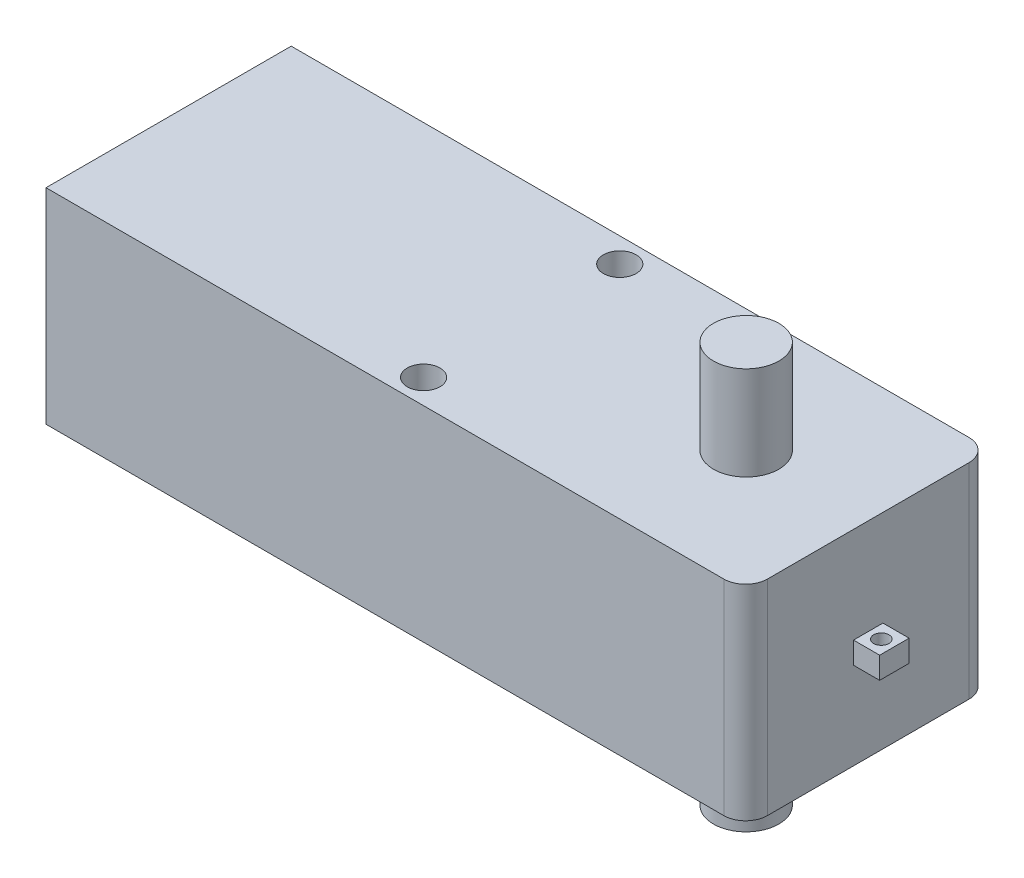
ISO-10303-21;
HEADER;
FILE_DESCRIPTION(('STEP AP214'),'2;1');
FILE_NAME('part.step','',(''),(''),'','','');
FILE_SCHEMA(('AUTOMOTIVE_DESIGN { 1 0 10303 214 1 1 1 1 }'));
ENDSEC;
DATA;
#1=APPLICATION_CONTEXT('core data for automotive mechanical design processes');
#2=APPLICATION_PROTOCOL_DEFINITION('international standard','automotive_design',2000,#1);
#3=PRODUCT_CONTEXT('',#1,'mechanical');
#4=PRODUCT('Part','Part','',(#3));
#5=PRODUCT_RELATED_PRODUCT_CATEGORY('part','',(#4));
#6=PRODUCT_DEFINITION_FORMATION('','',#4);
#7=PRODUCT_DEFINITION_CONTEXT('part definition',#1,'design');
#8=PRODUCT_DEFINITION('design','',#6,#7);
#9=PRODUCT_DEFINITION_SHAPE('','',#8);
#10=(LENGTH_UNIT() NAMED_UNIT(*) SI_UNIT(.MILLI.,.METRE.));
#11=(NAMED_UNIT(*) PLANE_ANGLE_UNIT() SI_UNIT($,.RADIAN.));
#12=(NAMED_UNIT(*) SI_UNIT($,.STERADIAN.) SOLID_ANGLE_UNIT());
#13=UNCERTAINTY_MEASURE_WITH_UNIT(LENGTH_MEASURE(1.E-05),#10,'distance_accuracy_value','');
#14=(GEOMETRIC_REPRESENTATION_CONTEXT(3) GLOBAL_UNCERTAINTY_ASSIGNED_CONTEXT((#13)) GLOBAL_UNIT_ASSIGNED_CONTEXT((#10,
#11,#12)) REPRESENTATION_CONTEXT('',''));
#15=CARTESIAN_POINT('',(0.,0.,0.));
#16=DIRECTION('',(0.,0.,1.));
#17=DIRECTION('',(1.,0.,0.));
#18=AXIS2_PLACEMENT_3D('',#15,#16,#17);
#19=CARTESIAN_POINT('',(64.2,18.8,0.));
#20=DIRECTION('',(-1.,0.,0.));
#21=DIRECTION('',(0.,0.,1.));
#22=AXIS2_PLACEMENT_3D('',#19,#20,#21);
#23=PLANE('',#22);
#24=DIRECTION('',(0.,0.,-1.));
#25=VECTOR('',#24,1.);
#26=CARTESIAN_POINT('',(64.2,18.8,0.));
#27=LINE('',#26,#25);
#28=CARTESIAN_POINT('',(64.2,18.8,-2.));
#29=VERTEX_POINT('',#28);
#30=CARTESIAN_POINT('',(64.2,18.8,-20.5));
#31=VERTEX_POINT('',#30);
#32=EDGE_CURVE('E175',#29,#31,#27,.T.);
#33=ORIENTED_EDGE('',*,*,#32,.F.);
#34=DIRECTION('',(0.,-1.,0.));
#35=VECTOR('',#34,1.);
#36=CARTESIAN_POINT('',(64.2,18.8,-2.));
#37=LINE('',#36,#35);
#38=CARTESIAN_POINT('',(64.2,0.,-2.));
#39=VERTEX_POINT('',#38);
#40=EDGE_CURVE('E195',#29,#39,#37,.T.);
#41=ORIENTED_EDGE('',*,*,#40,.T.);
#42=DIRECTION('',(0.,0.,-1.));
#43=VECTOR('',#42,1.);
#44=CARTESIAN_POINT('',(64.2,0.,0.));
#45=LINE('',#44,#43);
#46=CARTESIAN_POINT('',(64.2,0.,-20.5));
#47=VERTEX_POINT('',#46);
#48=EDGE_CURVE('E184',#39,#47,#45,.T.);
#49=ORIENTED_EDGE('',*,*,#48,.T.);
#50=DIRECTION('',(0.,-1.,0.));
#51=VECTOR('',#50,1.);
#52=CARTESIAN_POINT('',(64.2,18.8,-20.5));
#53=LINE('',#52,#51);
#54=EDGE_CURVE('E154',#47,#31,#53,.F.);
#55=ORIENTED_EDGE('',*,*,#54,.T.);
#56=EDGE_LOOP('',(#33,#41,#49,#55));
#57=FACE_BOUND('',#56,.T.);
#58=DIRECTION('',(0.,-1.,0.));
#59=VECTOR('',#58,1.);
#60=CARTESIAN_POINT('',(64.2,10.,-12.6006994628289));
#61=LINE('',#60,#59);
#62=CARTESIAN_POINT('',(64.2,10.,-12.6006994628289));
#63=VERTEX_POINT('',#62);
#64=CARTESIAN_POINT('',(64.2,8.,-12.6006994628289));
#65=VERTEX_POINT('',#64);
#66=EDGE_CURVE('E120',#63,#65,#61,.T.);
#67=ORIENTED_EDGE('',*,*,#66,.T.);
#68=DIRECTION('',(0.,0.,1.));
#69=VECTOR('',#68,1.);
#70=CARTESIAN_POINT('',(64.2,8.,-12.6006994628289));
#71=LINE('',#70,#69);
#72=CARTESIAN_POINT('',(64.2,8.,-9.89930053717109));
#73=VERTEX_POINT('',#72);
#74=EDGE_CURVE('E311',#65,#73,#71,.T.);
#75=ORIENTED_EDGE('',*,*,#74,.T.);
#76=DIRECTION('',(0.,-1.,0.));
#77=VECTOR('',#76,1.);
#78=CARTESIAN_POINT('',(64.2,10.,-9.89930053717109));
#79=LINE('',#78,#77);
#80=CARTESIAN_POINT('',(64.2,10.,-9.89930053717109));
#81=VERTEX_POINT('',#80);
#82=EDGE_CURVE('E144',#81,#73,#79,.T.);
#83=ORIENTED_EDGE('',*,*,#82,.F.);
#84=DIRECTION('',(0.,0.,1.));
#85=VECTOR('',#84,1.);
#86=CARTESIAN_POINT('',(64.2,10.,-12.6006994628289));
#87=LINE('',#86,#85);
#88=EDGE_CURVE('E123',#63,#81,#87,.T.);
#89=ORIENTED_EDGE('',*,*,#88,.F.);
#90=EDGE_LOOP('',(#67,#75,#83,#89));
#91=FACE_BOUND('',#90,.T.);
#92=ADVANCED_FACE('F33',(#57,#91),#23,.F.);
#93=CARTESIAN_POINT('',(0.,18.8,0.));
#94=DIRECTION('',(0.,-1.,0.));
#95=DIRECTION('',(0.,0.,-1.));
#96=AXIS2_PLACEMENT_3D('',#93,#94,#95);
#97=PLANE('',#96);
#98=CARTESIAN_POINT('',(53.,18.8,-11.25));
#99=DIRECTION('',(0.,-1.,0.));
#100=DIRECTION('',(0.,0.,-1.));
#101=AXIS2_PLACEMENT_3D('',#98,#99,#100);
#102=CIRCLE('',#101,3.);
#103=CARTESIAN_POINT('',(53.,18.8,-14.25));
#104=VERTEX_POINT('',#103);
#105=EDGE_CURVE('E151',#104,#104,#102,.F.);
#106=ORIENTED_EDGE('',*,*,#105,.F.);
#107=EDGE_LOOP('',(#106));
#108=FACE_BOUND('',#107,.T.);
#109=DIRECTION('',(1.,0.,0.));
#110=VECTOR('',#109,1.);
#111=CARTESIAN_POINT('',(0.,18.8,0.));
#112=LINE('',#111,#110);
#113=CARTESIAN_POINT('',(0.,18.8,0.));
#114=VERTEX_POINT('',#113);
#115=CARTESIAN_POINT('',(62.2,18.8,0.));
#116=VERTEX_POINT('',#115);
#117=EDGE_CURVE('E172',#114,#116,#112,.T.);
#118=ORIENTED_EDGE('',*,*,#117,.T.);
#119=CARTESIAN_POINT('',(62.2,18.8,-2.));
#120=DIRECTION('',(0.,-1.,0.));
#121=DIRECTION('',(0.,0.,-1.));
#122=AXIS2_PLACEMENT_3D('',#119,#120,#121);
#123=CIRCLE('',#122,2.);
#124=EDGE_CURVE('E41',#116,#29,#123,.F.);
#125=ORIENTED_EDGE('',*,*,#124,.T.);
#126=ORIENTED_EDGE('',*,*,#32,.T.);
#127=CARTESIAN_POINT('',(62.2,18.8,-20.5));
#128=DIRECTION('',(0.,-1.,0.));
#129=DIRECTION('',(0.,0.,-1.));
#130=AXIS2_PLACEMENT_3D('',#127,#128,#129);
#131=CIRCLE('',#130,2.);
#132=CARTESIAN_POINT('',(62.2,18.8,-22.5));
#133=VERTEX_POINT('',#132);
#134=EDGE_CURVE('E48',#31,#133,#131,.F.);
#135=ORIENTED_EDGE('',*,*,#134,.T.);
#136=DIRECTION('',(-1.,0.,0.));
#137=VECTOR('',#136,1.);
#138=CARTESIAN_POINT('',(0.,18.8,-22.5));
#139=LINE('',#138,#137);
#140=CARTESIAN_POINT('',(0.,18.8,-22.5));
#141=VERTEX_POINT('',#140);
#142=EDGE_CURVE('E177',#133,#141,#139,.T.);
#143=ORIENTED_EDGE('',*,*,#142,.T.);
#144=DIRECTION('',(0.,0.,1.));
#145=VECTOR('',#144,1.);
#146=CARTESIAN_POINT('',(0.,18.8,0.));
#147=LINE('',#146,#145);
#148=EDGE_CURVE('E169',#141,#114,#147,.T.);
#149=ORIENTED_EDGE('',*,*,#148,.T.);
#150=EDGE_LOOP('',(#118,#125,#126,#135,#143,#149));
#151=FACE_BOUND('',#150,.T.);
#152=CARTESIAN_POINT('',(32.4,18.8,-2.25));
#153=DIRECTION('',(0.,1.,0.));
#154=DIRECTION('',(0.,0.,1.));
#155=AXIS2_PLACEMENT_3D('',#152,#153,#154);
#156=CIRCLE('',#155,1.5);
#157=CARTESIAN_POINT('',(32.4,18.8,-0.749999999999992));
#158=VERTEX_POINT('',#157);
#159=EDGE_CURVE('E163',#158,#158,#156,.T.);
#160=ORIENTED_EDGE('',*,*,#159,.F.);
#161=EDGE_LOOP('',(#160));
#162=FACE_BOUND('',#161,.T.);
#163=CARTESIAN_POINT('',(32.4,18.8,-20.25));
#164=DIRECTION('',(0.,1.,0.));
#165=DIRECTION('',(0.,0.,-1.));
#166=AXIS2_PLACEMENT_3D('',#163,#164,#165);
#167=CIRCLE('',#166,1.5);
#168=CARTESIAN_POINT('',(32.4,18.8,-21.75));
#169=VERTEX_POINT('',#168);
#170=EDGE_CURVE('E156',#169,#169,#167,.T.);
#171=ORIENTED_EDGE('',*,*,#170,.F.);
#172=EDGE_LOOP('',(#171));
#173=FACE_BOUND('',#172,.T.);
#174=ADVANCED_FACE('F205',(#108,#151,#162,#173),#97,.F.);
#175=CARTESIAN_POINT('',(0.,0.,0.));
#176=DIRECTION('',(0.,-1.,0.));
#177=DIRECTION('',(0.,0.,-1.));
#178=AXIS2_PLACEMENT_3D('',#175,#176,#177);
#179=PLANE('',#178);
#180=CARTESIAN_POINT('',(53.,0.,-11.25));
#181=DIRECTION('',(0.,-1.,0.));
#182=DIRECTION('',(0.,0.,-1.));
#183=AXIS2_PLACEMENT_3D('',#180,#181,#182);
#184=CIRCLE('',#183,3.);
#185=CARTESIAN_POINT('',(53.,0.,-14.25));
#186=VERTEX_POINT('',#185);
#187=EDGE_CURVE('E149',#186,#186,#184,.F.);
#188=ORIENTED_EDGE('',*,*,#187,.T.);
#189=EDGE_LOOP('',(#188));
#190=FACE_BOUND('',#189,.T.);
#191=CARTESIAN_POINT('',(32.4,0.,-2.25));
#192=DIRECTION('',(0.,1.,0.));
#193=DIRECTION('',(0.,0.,1.));
#194=AXIS2_PLACEMENT_3D('',#191,#192,#193);
#195=CIRCLE('',#194,1.5);
#196=CARTESIAN_POINT('',(32.4,0.,-0.749999999999992));
#197=VERTEX_POINT('',#196);
#198=EDGE_CURVE('E159',#197,#197,#195,.T.);
#199=ORIENTED_EDGE('',*,*,#198,.T.);
#200=EDGE_LOOP('',(#199));
#201=FACE_BOUND('',#200,.T.);
#202=ORIENTED_EDGE('',*,*,#48,.F.);
#203=CARTESIAN_POINT('',(62.2,0.,-2.));
#204=DIRECTION('',(0.,-1.,0.));
#205=DIRECTION('',(0.,0.,-1.));
#206=AXIS2_PLACEMENT_3D('',#203,#204,#205);
#207=CIRCLE('',#206,2.);
#208=CARTESIAN_POINT('',(62.2,0.,0.));
#209=VERTEX_POINT('',#208);
#210=EDGE_CURVE('E200',#39,#209,#207,.T.);
#211=ORIENTED_EDGE('',*,*,#210,.T.);
#212=DIRECTION('',(1.,0.,0.));
#213=VECTOR('',#212,1.);
#214=CARTESIAN_POINT('',(0.,0.,0.));
#215=LINE('',#214,#213);
#216=CARTESIAN_POINT('',(0.,0.,0.));
#217=VERTEX_POINT('',#216);
#218=EDGE_CURVE('E182',#217,#209,#215,.T.);
#219=ORIENTED_EDGE('',*,*,#218,.F.);
#220=DIRECTION('',(0.,0.,1.));
#221=VECTOR('',#220,1.);
#222=CARTESIAN_POINT('',(0.,0.,0.));
#223=LINE('',#222,#221);
#224=CARTESIAN_POINT('',(0.,0.,-22.5));
#225=VERTEX_POINT('',#224);
#226=EDGE_CURVE('E166',#225,#217,#223,.T.);
#227=ORIENTED_EDGE('',*,*,#226,.F.);
#228=DIRECTION('',(-1.,0.,0.));
#229=VECTOR('',#228,1.);
#230=CARTESIAN_POINT('',(0.,0.,-22.5));
#231=LINE('',#230,#229);
#232=CARTESIAN_POINT('',(62.2,0.,-22.5));
#233=VERTEX_POINT('',#232);
#234=EDGE_CURVE('E173',#233,#225,#231,.T.);
#235=ORIENTED_EDGE('',*,*,#234,.F.);
#236=CARTESIAN_POINT('',(62.2,0.,-20.5));
#237=DIRECTION('',(0.,-1.,0.));
#238=DIRECTION('',(0.,0.,-1.));
#239=AXIS2_PLACEMENT_3D('',#236,#237,#238);
#240=CIRCLE('',#239,2.);
#241=EDGE_CURVE('E198',#233,#47,#240,.T.);
#242=ORIENTED_EDGE('',*,*,#241,.T.);
#243=EDGE_LOOP('',(#202,#211,#219,#227,#235,#242));
#244=FACE_BOUND('',#243,.T.);
#245=CARTESIAN_POINT('',(32.4,0.,-20.25));
#246=DIRECTION('',(0.,1.,0.));
#247=DIRECTION('',(0.,0.,-1.));
#248=AXIS2_PLACEMENT_3D('',#245,#246,#247);
#249=CIRCLE('',#248,1.5);
#250=CARTESIAN_POINT('',(32.4,0.,-21.75));
#251=VERTEX_POINT('',#250);
#252=EDGE_CURVE('E160',#251,#251,#249,.T.);
#253=ORIENTED_EDGE('',*,*,#252,.T.);
#254=EDGE_LOOP('',(#253));
#255=FACE_BOUND('',#254,.T.);
#256=ADVANCED_FACE('F215',(#190,#201,#244,#255),#179,.T.);
#257=CARTESIAN_POINT('',(0.,18.8,0.));
#258=DIRECTION('',(1.,0.,0.));
#259=DIRECTION('',(0.,0.,-1.));
#260=AXIS2_PLACEMENT_3D('',#257,#258,#259);
#261=PLANE('',#260);
#262=ORIENTED_EDGE('',*,*,#226,.T.);
#263=DIRECTION('',(0.,-1.,0.));
#264=VECTOR('',#263,1.);
#265=CARTESIAN_POINT('',(0.,18.8,0.));
#266=LINE('',#265,#264);
#267=EDGE_CURVE('E155',#114,#217,#266,.T.);
#268=ORIENTED_EDGE('',*,*,#267,.F.);
#269=ORIENTED_EDGE('',*,*,#148,.F.);
#270=DIRECTION('',(0.,-1.,0.));
#271=VECTOR('',#270,1.);
#272=CARTESIAN_POINT('',(0.,18.8,-22.5));
#273=LINE('',#272,#271);
#274=EDGE_CURVE('E179',#141,#225,#273,.T.);
#275=ORIENTED_EDGE('',*,*,#274,.T.);
#276=EDGE_LOOP('',(#262,#268,#269,#275));
#277=FACE_BOUND('',#276,.T.);
#278=ADVANCED_FACE('F222',(#277),#261,.F.);
#279=CARTESIAN_POINT('',(0.,18.8,0.));
#280=DIRECTION('',(0.,0.,-1.));
#281=DIRECTION('',(-1.,0.,0.));
#282=AXIS2_PLACEMENT_3D('',#279,#280,#281);
#283=PLANE('',#282);
#284=ORIENTED_EDGE('',*,*,#218,.T.);
#285=DIRECTION('',(0.,-1.,0.));
#286=VECTOR('',#285,1.);
#287=CARTESIAN_POINT('',(62.2,18.8,0.));
#288=LINE('',#287,#286);
#289=EDGE_CURVE('E56',#209,#116,#288,.F.);
#290=ORIENTED_EDGE('',*,*,#289,.T.);
#291=ORIENTED_EDGE('',*,*,#117,.F.);
#292=ORIENTED_EDGE('',*,*,#267,.T.);
#293=EDGE_LOOP('',(#284,#290,#291,#292));
#294=FACE_BOUND('',#293,.T.);
#295=ADVANCED_FACE('F218',(#294),#283,.F.);
#296=CARTESIAN_POINT('',(0.,18.8,-22.5));
#297=DIRECTION('',(0.,0.,1.));
#298=DIRECTION('',(1.,0.,0.));
#299=AXIS2_PLACEMENT_3D('',#296,#297,#298);
#300=PLANE('',#299);
#301=ORIENTED_EDGE('',*,*,#142,.F.);
#302=DIRECTION('',(0.,-1.,0.));
#303=VECTOR('',#302,1.);
#304=CARTESIAN_POINT('',(62.2,18.8,-22.5));
#305=LINE('',#304,#303);
#306=EDGE_CURVE('E11',#133,#233,#305,.T.);
#307=ORIENTED_EDGE('',*,*,#306,.T.);
#308=ORIENTED_EDGE('',*,*,#234,.T.);
#309=ORIENTED_EDGE('',*,*,#274,.F.);
#310=EDGE_LOOP('',(#301,#307,#308,#309));
#311=FACE_BOUND('',#310,.T.);
#312=ADVANCED_FACE('F226',(#311),#300,.F.);
#313=CARTESIAN_POINT('',(32.4,18.8,-2.25));
#314=DIRECTION('',(0.,-1.,0.));
#315=DIRECTION('',(0.,0.,-1.));
#316=AXIS2_PLACEMENT_3D('',#313,#314,#315);
#317=CYLINDRICAL_SURFACE('',#316,1.5);
#318=ORIENTED_EDGE('',*,*,#159,.T.);
#319=EDGE_LOOP('',(#318));
#320=FACE_BOUND('',#319,.T.);
#321=ORIENTED_EDGE('',*,*,#198,.F.);
#322=EDGE_LOOP('',(#321));
#323=FACE_BOUND('',#322,.T.);
#324=ADVANCED_FACE('F255',(#320,#323),#317,.F.);
#325=CARTESIAN_POINT('',(32.4,18.8,-20.25));
#326=DIRECTION('',(0.,-1.,0.));
#327=DIRECTION('',(0.,0.,-1.));
#328=AXIS2_PLACEMENT_3D('',#325,#326,#327);
#329=CYLINDRICAL_SURFACE('',#328,1.5);
#330=ORIENTED_EDGE('',*,*,#170,.T.);
#331=EDGE_LOOP('',(#330));
#332=FACE_BOUND('',#331,.T.);
#333=ORIENTED_EDGE('',*,*,#252,.F.);
#334=EDGE_LOOP('',(#333));
#335=FACE_BOUND('',#334,.T.);
#336=ADVANCED_FACE('F258',(#332,#335),#329,.F.);
#337=CARTESIAN_POINT('',(53.,-9.4,-11.25));
#338=DIRECTION('',(0.,1.,0.));
#339=DIRECTION('',(0.,0.,1.));
#340=AXIS2_PLACEMENT_3D('',#337,#338,#339);
#341=PLANE('',#340);
#342=CARTESIAN_POINT('',(53.,-9.4,-11.25));
#343=DIRECTION('',(0.,1.,0.));
#344=DIRECTION('',(0.,0.,1.));
#345=AXIS2_PLACEMENT_3D('',#342,#343,#344);
#346=CIRCLE('',#345,3.);
#347=CARTESIAN_POINT('',(53.,-9.4,-8.24999999999999));
#348=VERTEX_POINT('',#347);
#349=EDGE_CURVE('E139',#348,#348,#346,.T.);
#350=ORIENTED_EDGE('',*,*,#349,.F.);
#351=EDGE_LOOP('',(#350));
#352=FACE_BOUND('',#351,.T.);
#353=ADVANCED_FACE('F262',(#352),#341,.F.);
#354=CARTESIAN_POINT('',(53.,27.4,-11.25));
#355=DIRECTION('',(0.,-1.,0.));
#356=DIRECTION('',(0.,0.,-1.));
#357=AXIS2_PLACEMENT_3D('',#354,#355,#356);
#358=CYLINDRICAL_SURFACE('',#357,3.);
#359=ORIENTED_EDGE('',*,*,#187,.F.);
#360=EDGE_LOOP('',(#359));
#361=FACE_BOUND('',#360,.T.);
#362=ORIENTED_EDGE('',*,*,#349,.T.);
#363=EDGE_LOOP('',(#362));
#364=FACE_BOUND('',#363,.T.);
#365=ADVANCED_FACE('F264',(#361,#364),#358,.T.);
#366=CARTESIAN_POINT('',(53.,27.4,-11.25));
#367=DIRECTION('',(0.,1.,0.));
#368=DIRECTION('',(0.,0.,1.));
#369=AXIS2_PLACEMENT_3D('',#366,#367,#368);
#370=CIRCLE('',#369,3.);
#371=CARTESIAN_POINT('',(53.,27.4,-8.24999999999999));
#372=VERTEX_POINT('',#371);
#373=EDGE_CURVE('E142',#372,#372,#370,.T.);
#374=ORIENTED_EDGE('',*,*,#373,.F.);
#375=EDGE_LOOP('',(#374));
#376=FACE_BOUND('',#375,.T.);
#377=ORIENTED_EDGE('',*,*,#105,.T.);
#378=EDGE_LOOP('',(#377));
#379=FACE_BOUND('',#378,.T.);
#380=ADVANCED_FACE('F267',(#376,#379),#358,.T.);
#381=CARTESIAN_POINT('',(53.,27.4,-11.25));
#382=DIRECTION('',(0.,1.,0.));
#383=DIRECTION('',(0.,0.,1.));
#384=AXIS2_PLACEMENT_3D('',#381,#382,#383);
#385=PLANE('',#384);
#386=ORIENTED_EDGE('',*,*,#373,.T.);
#387=EDGE_LOOP('',(#386));
#388=FACE_BOUND('',#387,.T.);
#389=ADVANCED_FACE('F272',(#388),#385,.T.);
#390=CARTESIAN_POINT('',(0.,10.,0.));
#391=DIRECTION('',(0.,-1.,0.));
#392=DIRECTION('',(0.,0.,-1.));
#393=AXIS2_PLACEMENT_3D('',#390,#391,#392);
#394=PLANE('',#393);
#395=DIRECTION('',(0.,0.,-1.));
#396=VECTOR('',#395,1.);
#397=CARTESIAN_POINT('',(66.6,10.,-9.89930053717109));
#398=LINE('',#397,#396);
#399=CARTESIAN_POINT('',(66.6,10.,-9.89930053717109));
#400=VERTEX_POINT('',#399);
#401=CARTESIAN_POINT('',(66.6,10.,-12.6006994628289));
#402=VERTEX_POINT('',#401);
#403=EDGE_CURVE('E124',#400,#402,#398,.T.);
#404=ORIENTED_EDGE('',*,*,#403,.T.);
#405=DIRECTION('',(-1.,0.,0.));
#406=VECTOR('',#405,1.);
#407=CARTESIAN_POINT('',(64.2,10.,-12.6006994628289));
#408=LINE('',#407,#406);
#409=EDGE_CURVE('E113',#402,#63,#408,.T.);
#410=ORIENTED_EDGE('',*,*,#409,.T.);
#411=ORIENTED_EDGE('',*,*,#88,.T.);
#412=DIRECTION('',(1.,0.,0.));
#413=VECTOR('',#412,1.);
#414=CARTESIAN_POINT('',(64.2,10.,-9.89930053717109));
#415=LINE('',#414,#413);
#416=EDGE_CURVE('E130',#81,#400,#415,.T.);
#417=ORIENTED_EDGE('',*,*,#416,.T.);
#418=EDGE_LOOP('',(#404,#410,#411,#417));
#419=FACE_BOUND('',#418,.T.);
#420=CARTESIAN_POINT('',(65.4,10.,-11.25));
#421=DIRECTION('',(0.,1.,0.));
#422=DIRECTION('',(0.,0.,1.));
#423=AXIS2_PLACEMENT_3D('',#420,#421,#422);
#424=CIRCLE('',#423,0.700000000000002);
#425=CARTESIAN_POINT('',(65.4,10.,-10.55));
#426=VERTEX_POINT('',#425);
#427=EDGE_CURVE('E297',#426,#426,#424,.T.);
#428=ORIENTED_EDGE('',*,*,#427,.F.);
#429=EDGE_LOOP('',(#428));
#430=FACE_BOUND('',#429,.T.);
#431=ADVANCED_FACE('F127',(#419,#430),#394,.F.);
#432=CARTESIAN_POINT('',(0.,8.,0.));
#433=DIRECTION('',(0.,-1.,0.));
#434=DIRECTION('',(0.,0.,-1.));
#435=AXIS2_PLACEMENT_3D('',#432,#433,#434);
#436=PLANE('',#435);
#437=DIRECTION('',(0.,0.,-1.));
#438=VECTOR('',#437,1.);
#439=CARTESIAN_POINT('',(66.6,8.,-9.89930053717109));
#440=LINE('',#439,#438);
#441=CARTESIAN_POINT('',(66.6,8.,-9.89930053717109));
#442=VERTEX_POINT('',#441);
#443=CARTESIAN_POINT('',(66.6,8.,-12.6006994628289));
#444=VERTEX_POINT('',#443);
#445=EDGE_CURVE('E138',#442,#444,#440,.T.);
#446=ORIENTED_EDGE('',*,*,#445,.F.);
#447=DIRECTION('',(1.,0.,0.));
#448=VECTOR('',#447,1.);
#449=CARTESIAN_POINT('',(64.2,8.,-9.89930053717109));
#450=LINE('',#449,#448);
#451=EDGE_CURVE('E134',#73,#442,#450,.T.);
#452=ORIENTED_EDGE('',*,*,#451,.F.);
#453=ORIENTED_EDGE('',*,*,#74,.F.);
#454=DIRECTION('',(-1.,0.,0.));
#455=VECTOR('',#454,1.);
#456=CARTESIAN_POINT('',(64.2,8.,-12.6006994628289));
#457=LINE('',#456,#455);
#458=EDGE_CURVE('E309',#444,#65,#457,.T.);
#459=ORIENTED_EDGE('',*,*,#458,.F.);
#460=EDGE_LOOP('',(#446,#452,#453,#459));
#461=FACE_BOUND('',#460,.T.);
#462=CARTESIAN_POINT('',(65.4,8.,-11.25));
#463=DIRECTION('',(0.,1.,0.));
#464=DIRECTION('',(0.,0.,1.));
#465=AXIS2_PLACEMENT_3D('',#462,#463,#464);
#466=CIRCLE('',#465,0.700000000000002);
#467=CARTESIAN_POINT('',(65.4,8.,-10.55));
#468=VERTEX_POINT('',#467);
#469=EDGE_CURVE('E300',#468,#468,#466,.T.);
#470=ORIENTED_EDGE('',*,*,#469,.T.);
#471=EDGE_LOOP('',(#470));
#472=FACE_BOUND('',#471,.T.);
#473=ADVANCED_FACE('F278',(#461,#472),#436,.T.);
#474=CARTESIAN_POINT('',(66.6,10.,-9.89930053717109));
#475=DIRECTION('',(-1.,0.,0.));
#476=DIRECTION('',(0.,0.,1.));
#477=AXIS2_PLACEMENT_3D('',#474,#475,#476);
#478=PLANE('',#477);
#479=ORIENTED_EDGE('',*,*,#445,.T.);
#480=DIRECTION('',(0.,-1.,0.));
#481=VECTOR('',#480,1.);
#482=CARTESIAN_POINT('',(66.6,10.,-12.6006994628289));
#483=LINE('',#482,#481);
#484=EDGE_CURVE('E118',#402,#444,#483,.T.);
#485=ORIENTED_EDGE('',*,*,#484,.F.);
#486=ORIENTED_EDGE('',*,*,#403,.F.);
#487=DIRECTION('',(0.,-1.,0.));
#488=VECTOR('',#487,1.);
#489=CARTESIAN_POINT('',(66.6,10.,-9.89930053717109));
#490=LINE('',#489,#488);
#491=EDGE_CURVE('E307',#400,#442,#490,.T.);
#492=ORIENTED_EDGE('',*,*,#491,.T.);
#493=EDGE_LOOP('',(#479,#485,#486,#492));
#494=FACE_BOUND('',#493,.T.);
#495=ADVANCED_FACE('F136',(#494),#478,.F.);
#496=CARTESIAN_POINT('',(64.2,10.,-12.6006994628289));
#497=DIRECTION('',(0.,0.,1.));
#498=DIRECTION('',(1.,0.,0.));
#499=AXIS2_PLACEMENT_3D('',#496,#497,#498);
#500=PLANE('',#499);
#501=ORIENTED_EDGE('',*,*,#458,.T.);
#502=ORIENTED_EDGE('',*,*,#66,.F.);
#503=ORIENTED_EDGE('',*,*,#409,.F.);
#504=ORIENTED_EDGE('',*,*,#484,.T.);
#505=EDGE_LOOP('',(#501,#502,#503,#504));
#506=FACE_BOUND('',#505,.T.);
#507=ADVANCED_FACE('F116',(#506),#500,.F.);
#508=CARTESIAN_POINT('',(64.2,10.,-9.89930053717109));
#509=DIRECTION('',(0.,0.,-1.));
#510=DIRECTION('',(-1.,0.,0.));
#511=AXIS2_PLACEMENT_3D('',#508,#509,#510);
#512=PLANE('',#511);
#513=ORIENTED_EDGE('',*,*,#451,.T.);
#514=ORIENTED_EDGE('',*,*,#491,.F.);
#515=ORIENTED_EDGE('',*,*,#416,.F.);
#516=ORIENTED_EDGE('',*,*,#82,.T.);
#517=EDGE_LOOP('',(#513,#514,#515,#516));
#518=FACE_BOUND('',#517,.T.);
#519=ADVANCED_FACE('F281',(#518),#512,.F.);
#520=CARTESIAN_POINT('',(65.4,10.,-11.25));
#521=DIRECTION('',(0.,-1.,0.));
#522=DIRECTION('',(0.,0.,-1.));
#523=AXIS2_PLACEMENT_3D('',#520,#521,#522);
#524=CYLINDRICAL_SURFACE('',#523,0.700000000000002);
#525=ORIENTED_EDGE('',*,*,#427,.T.);
#526=EDGE_LOOP('',(#525));
#527=FACE_BOUND('',#526,.T.);
#528=ORIENTED_EDGE('',*,*,#469,.F.);
#529=EDGE_LOOP('',(#528));
#530=FACE_BOUND('',#529,.T.);
#531=ADVANCED_FACE('F233',(#527,#530),#524,.F.);
#532=CARTESIAN_POINT('',(62.2,18.8,-2.));
#533=DIRECTION('',(0.,-1.,0.));
#534=DIRECTION('',(0.,0.,-1.));
#535=AXIS2_PLACEMENT_3D('',#532,#533,#534);
#536=CYLINDRICAL_SURFACE('',#535,2.);
#537=ORIENTED_EDGE('',*,*,#124,.F.);
#538=ORIENTED_EDGE('',*,*,#289,.F.);
#539=ORIENTED_EDGE('',*,*,#210,.F.);
#540=ORIENTED_EDGE('',*,*,#40,.F.);
#541=EDGE_LOOP('',(#537,#538,#539,#540));
#542=FACE_BOUND('',#541,.T.);
#543=ADVANCED_FACE('F213',(#542),#536,.T.);
#544=CARTESIAN_POINT('',(62.2,18.8,-20.5));
#545=DIRECTION('',(0.,-1.,0.));
#546=DIRECTION('',(0.,0.,-1.));
#547=AXIS2_PLACEMENT_3D('',#544,#545,#546);
#548=CYLINDRICAL_SURFACE('',#547,2.);
#549=ORIENTED_EDGE('',*,*,#134,.F.);
#550=ORIENTED_EDGE('',*,*,#54,.F.);
#551=ORIENTED_EDGE('',*,*,#241,.F.);
#552=ORIENTED_EDGE('',*,*,#306,.F.);
#553=EDGE_LOOP('',(#549,#550,#551,#552));
#554=FACE_BOUND('',#553,.T.);
#555=ADVANCED_FACE('F35',(#554),#548,.T.);
#556=CLOSED_SHELL('',(#92,#174,#256,#278,#295,#312,#324,#336,#353,#365,#380,#389,#431,#473,#495,
#507,#519,#531,#543,#555));
#557=MANIFOLD_SOLID_BREP('B2',#556);
#558=ADVANCED_BREP_SHAPE_REPRESENTATION('',(#18,#557),#14);
#559=SHAPE_DEFINITION_REPRESENTATION(#9,#558);
ENDSEC;
END-ISO-10303-21;
